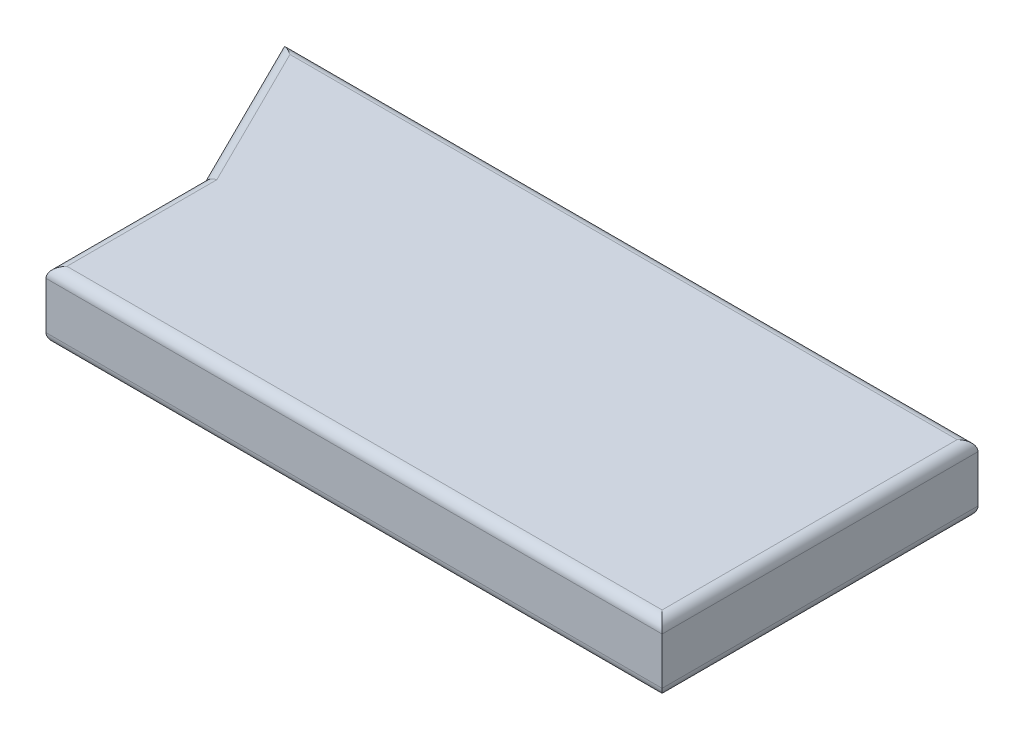
ISO-10303-21;
HEADER;
FILE_DESCRIPTION(('STEP AP214'),'2;1');
FILE_NAME('part.step','',(''),(''),'','','');
FILE_SCHEMA(('AUTOMOTIVE_DESIGN { 1 0 10303 214 1 1 1 1 }'));
ENDSEC;
DATA;
#1=APPLICATION_CONTEXT('core data for automotive mechanical design processes');
#2=APPLICATION_PROTOCOL_DEFINITION('international standard','automotive_design',2000,#1);
#3=PRODUCT_CONTEXT('',#1,'mechanical');
#4=PRODUCT('Part','Part','',(#3));
#5=PRODUCT_RELATED_PRODUCT_CATEGORY('part','',(#4));
#6=PRODUCT_DEFINITION_FORMATION('','',#4);
#7=PRODUCT_DEFINITION_CONTEXT('part definition',#1,'design');
#8=PRODUCT_DEFINITION('design','',#6,#7);
#9=PRODUCT_DEFINITION_SHAPE('','',#8);
#10=(LENGTH_UNIT() NAMED_UNIT(*) SI_UNIT(.MILLI.,.METRE.));
#11=(NAMED_UNIT(*) PLANE_ANGLE_UNIT() SI_UNIT($,.RADIAN.));
#12=(NAMED_UNIT(*) SI_UNIT($,.STERADIAN.) SOLID_ANGLE_UNIT());
#13=UNCERTAINTY_MEASURE_WITH_UNIT(LENGTH_MEASURE(1.E-05),#10,'distance_accuracy_value','');
#14=(GEOMETRIC_REPRESENTATION_CONTEXT(3) GLOBAL_UNCERTAINTY_ASSIGNED_CONTEXT((#13)) GLOBAL_UNIT_ASSIGNED_CONTEXT((#10,
#11,#12)) REPRESENTATION_CONTEXT('',''));
#15=CARTESIAN_POINT('',(0.,0.,0.));
#16=DIRECTION('',(0.,0.,1.));
#17=DIRECTION('',(1.,0.,0.));
#18=AXIS2_PLACEMENT_3D('',#15,#16,#17);
#19=CARTESIAN_POINT('',(0.,13.,-30.25));
#20=DIRECTION('',(0.,0.,1.));
#21=DIRECTION('',(1.,0.,0.));
#22=AXIS2_PLACEMENT_3D('',#19,#20,#21);
#23=PLANE('',#22);
#24=DIRECTION('',(0.,-1.,0.));
#25=VECTOR('',#24,1.);
#26=CARTESIAN_POINT('',(59.,13.,-30.25));
#27=LINE('',#26,#25);
#28=CARTESIAN_POINT('',(59.,11.,-30.25));
#29=VERTEX_POINT('',#28);
#30=CARTESIAN_POINT('',(59.,2.,-30.25));
#31=VERTEX_POINT('',#30);
#32=EDGE_CURVE('E172',#29,#31,#27,.T.);
#33=ORIENTED_EDGE('',*,*,#32,.T.);
#34=DIRECTION('',(-1.,0.,0.));
#35=VECTOR('',#34,1.);
#36=CARTESIAN_POINT('',(0.,2.,-30.25));
#37=LINE('',#36,#35);
#38=CARTESIAN_POINT('',(-74.,2.,-30.25));
#39=VERTEX_POINT('',#38);
#40=EDGE_CURVE('E11',#31,#39,#37,.T.);
#41=ORIENTED_EDGE('',*,*,#40,.T.);
#42=DIRECTION('',(0.,-1.,0.));
#43=VECTOR('',#42,1.);
#44=CARTESIAN_POINT('',(-74.,13.,-30.25));
#45=LINE('',#44,#43);
#46=CARTESIAN_POINT('',(-74.,11.,-30.25));
#47=VERTEX_POINT('',#46);
#48=EDGE_CURVE('E143',#47,#39,#45,.T.);
#49=ORIENTED_EDGE('',*,*,#48,.F.);
#50=DIRECTION('',(-1.,0.,0.));
#51=VECTOR('',#50,1.);
#52=CARTESIAN_POINT('',(59.,11.,-30.2500000000001));
#53=LINE('',#52,#51);
#54=EDGE_CURVE('E161',#47,#29,#53,.F.);
#55=ORIENTED_EDGE('',*,*,#54,.T.);
#56=EDGE_LOOP('',(#33,#41,#49,#55));
#57=FACE_BOUND('',#56,.T.);
#58=ADVANCED_FACE('F43',(#57),#23,.F.);
#59=CARTESIAN_POINT('',(-47.3559015404857,13.,23.4822652266871));
#60=DIRECTION('',(0.895903119199438,0.,-0.444249480594763));
#61=DIRECTION('',(-0.444249480594763,0.,-0.895903119199438));
#62=AXIS2_PLACEMENT_3D('',#59,#60,#61);
#63=PLANE('',#62);
#64=ORIENTED_EDGE('',*,*,#48,.T.);
#65=DIRECTION('',(0.444249480594763,0.,0.895903119199438));
#66=VECTOR('',#65,1.);
#67=CARTESIAN_POINT('',(-47.3559015404857,2.,23.4822652266871));
#68=LINE('',#67,#66);
#69=CARTESIAN_POINT('',(-59.,2.,0.));
#70=VERTEX_POINT('',#69);
#71=EDGE_CURVE('E162',#39,#70,#68,.T.);
#72=ORIENTED_EDGE('',*,*,#71,.T.);
#73=DIRECTION('',(0.,-1.,0.));
#74=VECTOR('',#73,1.);
#75=CARTESIAN_POINT('',(-59.,13.,0.));
#76=LINE('',#75,#74);
#77=CARTESIAN_POINT('',(-59.,11.,0.));
#78=VERTEX_POINT('',#77);
#79=EDGE_CURVE('E221',#78,#70,#76,.T.);
#80=ORIENTED_EDGE('',*,*,#79,.F.);
#81=DIRECTION('',(0.444249480594763,0.,0.895903119199438));
#82=VECTOR('',#81,1.);
#83=CARTESIAN_POINT('',(-74.,11.,-30.25));
#84=LINE('',#83,#82);
#85=EDGE_CURVE('E159',#78,#47,#84,.F.);
#86=ORIENTED_EDGE('',*,*,#85,.T.);
#87=EDGE_LOOP('',(#64,#72,#80,#86));
#88=FACE_BOUND('',#87,.T.);
#89=ADVANCED_FACE('F217',(#88),#63,.F.);
#90=CARTESIAN_POINT('',(-59.,13.,0.));
#91=DIRECTION('',(-1.,0.,0.));
#92=DIRECTION('',(0.,0.,1.));
#93=AXIS2_PLACEMENT_3D('',#90,#91,#92);
#94=PLANE('',#93);
#95=ORIENTED_EDGE('',*,*,#79,.T.);
#96=DIRECTION('',(0.,0.,-1.));
#97=VECTOR('',#96,1.);
#98=CARTESIAN_POINT('',(-59.,2.,30.25));
#99=LINE('',#98,#97);
#100=CARTESIAN_POINT('',(-59.,2.,30.25));
#101=VERTEX_POINT('',#100);
#102=EDGE_CURVE('E186',#70,#101,#99,.F.);
#103=ORIENTED_EDGE('',*,*,#102,.T.);
#104=DIRECTION('',(0.,-1.,0.));
#105=VECTOR('',#104,1.);
#106=CARTESIAN_POINT('',(-59.,13.,30.25));
#107=LINE('',#106,#105);
#108=CARTESIAN_POINT('',(-59.,11.,30.25));
#109=VERTEX_POINT('',#108);
#110=EDGE_CURVE('E223',#109,#101,#107,.T.);
#111=ORIENTED_EDGE('',*,*,#110,.F.);
#112=DIRECTION('',(0.,0.,-1.));
#113=VECTOR('',#112,1.);
#114=CARTESIAN_POINT('',(-59.,11.,0.));
#115=LINE('',#114,#113);
#116=EDGE_CURVE('E157',#109,#78,#115,.T.);
#117=ORIENTED_EDGE('',*,*,#116,.T.);
#118=EDGE_LOOP('',(#95,#103,#111,#117));
#119=FACE_BOUND('',#118,.T.);
#120=ADVANCED_FACE('F243',(#119),#94,.T.);
#121=CARTESIAN_POINT('',(0.,13.,30.25));
#122=DIRECTION('',(0.,0.,-1.));
#123=DIRECTION('',(-1.,0.,0.));
#124=AXIS2_PLACEMENT_3D('',#121,#122,#123);
#125=PLANE('',#124);
#126=ORIENTED_EDGE('',*,*,#110,.T.);
#127=DIRECTION('',(1.,0.,0.));
#128=VECTOR('',#127,1.);
#129=CARTESIAN_POINT('',(0.,2.,30.25));
#130=LINE('',#129,#128);
#131=CARTESIAN_POINT('',(59.,2.,30.25));
#132=VERTEX_POINT('',#131);
#133=EDGE_CURVE('E67',#101,#132,#130,.T.);
#134=ORIENTED_EDGE('',*,*,#133,.T.);
#135=DIRECTION('',(0.,-1.,0.));
#136=VECTOR('',#135,1.);
#137=CARTESIAN_POINT('',(59.,13.,30.25));
#138=LINE('',#137,#136);
#139=CARTESIAN_POINT('',(59.,11.,30.25));
#140=VERTEX_POINT('',#139);
#141=EDGE_CURVE('E238',#140,#132,#138,.T.);
#142=ORIENTED_EDGE('',*,*,#141,.F.);
#143=DIRECTION('',(1.,0.,0.));
#144=VECTOR('',#143,1.);
#145=CARTESIAN_POINT('',(-59.,11.,30.25));
#146=LINE('',#145,#144);
#147=EDGE_CURVE('E150',#140,#109,#146,.F.);
#148=ORIENTED_EDGE('',*,*,#147,.T.);
#149=EDGE_LOOP('',(#126,#134,#142,#148));
#150=FACE_BOUND('',#149,.T.);
#151=ADVANCED_FACE('F239',(#150),#125,.F.);
#152=CARTESIAN_POINT('',(59.,13.,0.));
#153=DIRECTION('',(-1.,0.,0.));
#154=DIRECTION('',(0.,0.,1.));
#155=AXIS2_PLACEMENT_3D('',#152,#153,#154);
#156=PLANE('',#155);
#157=ORIENTED_EDGE('',*,*,#141,.T.);
#158=DIRECTION('',(0.,0.,-1.));
#159=VECTOR('',#158,1.);
#160=CARTESIAN_POINT('',(59.,2.,0.));
#161=LINE('',#160,#159);
#162=EDGE_CURVE('E52',#132,#31,#161,.T.);
#163=ORIENTED_EDGE('',*,*,#162,.T.);
#164=ORIENTED_EDGE('',*,*,#32,.F.);
#165=DIRECTION('',(0.,0.,-1.));
#166=VECTOR('',#165,1.);
#167=CARTESIAN_POINT('',(59.,11.,30.25));
#168=LINE('',#167,#166);
#169=EDGE_CURVE('E130',#29,#140,#168,.F.);
#170=ORIENTED_EDGE('',*,*,#169,.T.);
#171=EDGE_LOOP('',(#157,#163,#164,#170));
#172=FACE_BOUND('',#171,.T.);
#173=ADVANCED_FACE('F237',(#172),#156,.F.);
#174=CARTESIAN_POINT('',(0.,13.,0.));
#175=DIRECTION('',(0.,1.,0.));
#176=DIRECTION('',(0.,0.,1.));
#177=AXIS2_PLACEMENT_3D('',#174,#175,#176);
#178=PLANE('',#177);
#179=DIRECTION('',(1.,0.,0.));
#180=VECTOR('',#179,1.);
#181=CARTESIAN_POINT('',(59.,13.,28.25));
#182=LINE('',#181,#180);
#183=CARTESIAN_POINT('',(-57.,13.,28.25));
#184=VERTEX_POINT('',#183);
#185=CARTESIAN_POINT('',(57.,13.,28.25));
#186=VERTEX_POINT('',#185);
#187=EDGE_CURVE('E147',#184,#186,#182,.T.);
#188=ORIENTED_EDGE('',*,*,#187,.T.);
#189=DIRECTION('',(0.,0.,-1.));
#190=VECTOR('',#189,1.);
#191=CARTESIAN_POINT('',(57.,13.,-30.25));
#192=LINE('',#191,#190);
#193=CARTESIAN_POINT('',(57.,13.,-28.2500000000001));
#194=VERTEX_POINT('',#193);
#195=EDGE_CURVE('E128',#186,#194,#192,.T.);
#196=ORIENTED_EDGE('',*,*,#195,.T.);
#197=DIRECTION('',(-1.,0.,0.));
#198=VECTOR('',#197,1.);
#199=CARTESIAN_POINT('',(-74.,13.,-28.25));
#200=LINE('',#199,#198);
#201=CARTESIAN_POINT('',(-70.775880227127,13.,-28.25));
#202=VERTEX_POINT('',#201);
#203=EDGE_CURVE('E136',#194,#202,#200,.T.);
#204=ORIENTED_EDGE('',*,*,#203,.T.);
#205=DIRECTION('',(0.444249480594763,0.,0.895903119199438));
#206=VECTOR('',#205,1.);
#207=CARTESIAN_POINT('',(-57.2081937616011,13.,-0.888498961189546));
#208=LINE('',#207,#206);
#209=CARTESIAN_POINT('',(-57.,13.,-0.468641541960611));
#210=VERTEX_POINT('',#209);
#211=EDGE_CURVE('E142',#202,#210,#208,.T.);
#212=ORIENTED_EDGE('',*,*,#211,.T.);
#213=DIRECTION('',(0.,0.,-1.));
#214=VECTOR('',#213,1.);
#215=CARTESIAN_POINT('',(-57.,13.,0.));
#216=LINE('',#215,#214);
#217=EDGE_CURVE('E152',#210,#184,#216,.F.);
#218=ORIENTED_EDGE('',*,*,#217,.T.);
#219=EDGE_LOOP('',(#188,#196,#204,#212,#218));
#220=FACE_BOUND('',#219,.T.);
#221=ADVANCED_FACE('F145',(#220),#178,.T.);
#222=CARTESIAN_POINT('',(0.,0.,0.));
#223=DIRECTION('',(0.,1.,0.));
#224=DIRECTION('',(0.,0.,1.));
#225=AXIS2_PLACEMENT_3D('',#222,#223,#224);
#226=PLANE('',#225);
#227=DIRECTION('',(0.,0.,-1.));
#228=VECTOR('',#227,1.);
#229=CARTESIAN_POINT('',(-57.,0.,0.));
#230=LINE('',#229,#228);
#231=CARTESIAN_POINT('',(-57.,0.,28.25));
#232=VERTEX_POINT('',#231);
#233=CARTESIAN_POINT('',(-57.,0.,-0.468641541960597));
#234=VERTEX_POINT('',#233);
#235=EDGE_CURVE('E181',#232,#234,#230,.T.);
#236=ORIENTED_EDGE('',*,*,#235,.T.);
#237=DIRECTION('',(0.444249480594763,0.,0.895903119199438));
#238=VECTOR('',#237,1.);
#239=CARTESIAN_POINT('',(-45.5640953020868,0.,22.5937662654976));
#240=LINE('',#239,#238);
#241=CARTESIAN_POINT('',(-70.775880227127,0.,-28.25));
#242=VERTEX_POINT('',#241);
#243=EDGE_CURVE('E183',#234,#242,#240,.F.);
#244=ORIENTED_EDGE('',*,*,#243,.T.);
#245=DIRECTION('',(-1.,0.,0.));
#246=VECTOR('',#245,1.);
#247=CARTESIAN_POINT('',(0.,0.,-28.25));
#248=LINE('',#247,#246);
#249=CARTESIAN_POINT('',(57.,0.,-28.2500000000001));
#250=VERTEX_POINT('',#249);
#251=EDGE_CURVE('E175',#242,#250,#248,.F.);
#252=ORIENTED_EDGE('',*,*,#251,.T.);
#253=DIRECTION('',(0.,0.,-1.));
#254=VECTOR('',#253,1.);
#255=CARTESIAN_POINT('',(57.,0.,0.));
#256=LINE('',#255,#254);
#257=CARTESIAN_POINT('',(57.,0.,28.25));
#258=VERTEX_POINT('',#257);
#259=EDGE_CURVE('E177',#250,#258,#256,.F.);
#260=ORIENTED_EDGE('',*,*,#259,.T.);
#261=DIRECTION('',(1.,0.,0.));
#262=VECTOR('',#261,1.);
#263=CARTESIAN_POINT('',(0.,0.,28.25));
#264=LINE('',#263,#262);
#265=EDGE_CURVE('E179',#258,#232,#264,.F.);
#266=ORIENTED_EDGE('',*,*,#265,.T.);
#267=EDGE_LOOP('',(#236,#244,#252,#260,#266));
#268=FACE_BOUND('',#267,.T.);
#269=ADVANCED_FACE('F251',(#268),#226,.F.);
#270=CARTESIAN_POINT('',(-57.,11.,0.));
#271=DIRECTION('',(0.,0.,-1.));
#272=DIRECTION('',(-1.,0.,0.));
#273=AXIS2_PLACEMENT_3D('',#270,#271,#272);
#274=CYLINDRICAL_SURFACE('',#273,2.);
#275=CARTESIAN_POINT('',(-57.,11.,28.25));
#276=DIRECTION('',(-0.707106781186547,0.,-0.707106781186547));
#277=DIRECTION('',(0.707106781186547,0.,-0.707106781186547));
#278=AXIS2_PLACEMENT_3D('',#275,#276,#277);
#279=ELLIPSE('',#278,2.82842712474619,2.);
#280=EDGE_CURVE('E166',#184,#109,#279,.F.);
#281=ORIENTED_EDGE('',*,*,#280,.F.);
#282=ORIENTED_EDGE('',*,*,#217,.F.);
#283=CARTESIAN_POINT('',(-57.,11.,-0.46864154196062));
#284=DIRECTION('',(-0.228141272899668,0.,-0.973628039653604));
#285=DIRECTION('',(0.973628039653604,0.,-0.228141272899668));
#286=AXIS2_PLACEMENT_3D('',#283,#284,#285);
#287=ELLIPSE('',#286,2.05417255722376,2.);
#288=EDGE_CURVE('E169',#78,#210,#287,.T.);
#289=ORIENTED_EDGE('',*,*,#288,.F.);
#290=ORIENTED_EDGE('',*,*,#116,.F.);
#291=EDGE_LOOP('',(#281,#282,#289,#290));
#292=FACE_BOUND('',#291,.T.);
#293=ADVANCED_FACE('F232',(#292),#274,.T.);
#294=CARTESIAN_POINT('',(-45.5640953020868,11.,22.5937662654976));
#295=DIRECTION('',(-0.444249480594763,0.,-0.895903119199438));
#296=DIRECTION('',(-0.895903119199438,0.,0.444249480594763));
#297=AXIS2_PLACEMENT_3D('',#294,#295,#296);
#298=CYLINDRICAL_SURFACE('',#297,2.);
#299=ORIENTED_EDGE('',*,*,#288,.T.);
#300=ORIENTED_EDGE('',*,*,#211,.F.);
#301=CARTESIAN_POINT('',(-70.775880227127,11.,-28.25));
#302=DIRECTION('',(0.527138748056542,0.,-0.849779230328314));
#303=DIRECTION('',(0.849779230328314,0.,0.527138748056542));
#304=AXIS2_PLACEMENT_3D('',#301,#302,#303);
#305=ELLIPSE('',#304,3.79406751519142,2.);
#306=EDGE_CURVE('E139',#47,#202,#305,.T.);
#307=ORIENTED_EDGE('',*,*,#306,.F.);
#308=ORIENTED_EDGE('',*,*,#85,.F.);
#309=EDGE_LOOP('',(#299,#300,#307,#308));
#310=FACE_BOUND('',#309,.T.);
#311=ADVANCED_FACE('F275',(#310),#298,.T.);
#312=CARTESIAN_POINT('',(0.,11.,28.25));
#313=DIRECTION('',(-1.,0.,0.));
#314=DIRECTION('',(0.,0.,1.));
#315=AXIS2_PLACEMENT_3D('',#312,#313,#314);
#316=CYLINDRICAL_SURFACE('',#315,2.);
#317=ORIENTED_EDGE('',*,*,#280,.T.);
#318=ORIENTED_EDGE('',*,*,#147,.F.);
#319=CARTESIAN_POINT('',(57.,11.,28.25));
#320=DIRECTION('',(-0.707106781186547,0.,0.707106781186547));
#321=DIRECTION('',(-0.707106781186547,0.,-0.707106781186547));
#322=AXIS2_PLACEMENT_3D('',#319,#320,#321);
#323=ELLIPSE('',#322,2.82842712474619,2.);
#324=EDGE_CURVE('E133',#186,#140,#323,.F.);
#325=ORIENTED_EDGE('',*,*,#324,.F.);
#326=ORIENTED_EDGE('',*,*,#187,.F.);
#327=EDGE_LOOP('',(#317,#318,#325,#326));
#328=FACE_BOUND('',#327,.T.);
#329=ADVANCED_FACE('F235',(#328),#316,.T.);
#330=CARTESIAN_POINT('',(0.,11.,-28.25));
#331=DIRECTION('',(1.,0.,0.));
#332=DIRECTION('',(0.,0.,-1.));
#333=AXIS2_PLACEMENT_3D('',#330,#331,#332);
#334=CYLINDRICAL_SURFACE('',#333,2.);
#335=ORIENTED_EDGE('',*,*,#306,.T.);
#336=ORIENTED_EDGE('',*,*,#203,.F.);
#337=CARTESIAN_POINT('',(57.,11.,-28.2500000000001));
#338=DIRECTION('',(0.707106781186548,0.,0.707106781186547));
#339=DIRECTION('',(0.707106781186547,0.,-0.707106781186548));
#340=AXIS2_PLACEMENT_3D('',#337,#338,#339);
#341=ELLIPSE('',#340,2.82842712474619,2.);
#342=EDGE_CURVE('E124',#29,#194,#341,.T.);
#343=ORIENTED_EDGE('',*,*,#342,.F.);
#344=ORIENTED_EDGE('',*,*,#54,.F.);
#345=EDGE_LOOP('',(#335,#336,#343,#344));
#346=FACE_BOUND('',#345,.T.);
#347=ADVANCED_FACE('F137',(#346),#334,.T.);
#348=CARTESIAN_POINT('',(57.,11.,0.));
#349=DIRECTION('',(0.,0.,1.));
#350=DIRECTION('',(1.,0.,0.));
#351=AXIS2_PLACEMENT_3D('',#348,#349,#350);
#352=CYLINDRICAL_SURFACE('',#351,2.);
#353=ORIENTED_EDGE('',*,*,#324,.T.);
#354=ORIENTED_EDGE('',*,*,#169,.F.);
#355=ORIENTED_EDGE('',*,*,#342,.T.);
#356=ORIENTED_EDGE('',*,*,#195,.F.);
#357=EDGE_LOOP('',(#353,#354,#355,#356));
#358=FACE_BOUND('',#357,.T.);
#359=ADVANCED_FACE('F126',(#358),#352,.T.);
#360=CARTESIAN_POINT('',(57.,2.,0.));
#361=DIRECTION('',(0.,0.,-1.));
#362=DIRECTION('',(-1.,0.,0.));
#363=AXIS2_PLACEMENT_3D('',#360,#361,#362);
#364=CYLINDRICAL_SURFACE('',#363,2.);
#365=CARTESIAN_POINT('',(57.,2.,-28.2500000000001));
#366=DIRECTION('',(-0.707106781186548,0.,-0.707106781186547));
#367=DIRECTION('',(-0.707106781186547,0.,0.707106781186548));
#368=AXIS2_PLACEMENT_3D('',#365,#366,#367);
#369=ELLIPSE('',#368,2.82842712474619,2.);
#370=EDGE_CURVE('E196',#31,#250,#369,.T.);
#371=ORIENTED_EDGE('',*,*,#370,.F.);
#372=ORIENTED_EDGE('',*,*,#162,.F.);
#373=CARTESIAN_POINT('',(57.,2.,28.25));
#374=DIRECTION('',(0.707106781186547,0.,-0.707106781186547));
#375=DIRECTION('',(-0.707106781186547,0.,-0.707106781186547));
#376=AXIS2_PLACEMENT_3D('',#373,#374,#375);
#377=ELLIPSE('',#376,2.82842712474619,2.);
#378=EDGE_CURVE('E47',#258,#132,#377,.F.);
#379=ORIENTED_EDGE('',*,*,#378,.F.);
#380=ORIENTED_EDGE('',*,*,#259,.F.);
#381=EDGE_LOOP('',(#371,#372,#379,#380));
#382=FACE_BOUND('',#381,.T.);
#383=ADVANCED_FACE('F45',(#382),#364,.T.);
#384=CARTESIAN_POINT('',(0.,2.,28.25));
#385=DIRECTION('',(1.,0.,0.));
#386=DIRECTION('',(0.,0.,-1.));
#387=AXIS2_PLACEMENT_3D('',#384,#385,#386);
#388=CYLINDRICAL_SURFACE('',#387,2.);
#389=ORIENTED_EDGE('',*,*,#378,.T.);
#390=ORIENTED_EDGE('',*,*,#133,.F.);
#391=CARTESIAN_POINT('',(-57.,2.,28.25));
#392=DIRECTION('',(0.707106781186547,0.,0.707106781186547));
#393=DIRECTION('',(0.707106781186547,0.,-0.707106781186547));
#394=AXIS2_PLACEMENT_3D('',#391,#392,#393);
#395=ELLIPSE('',#394,2.82842712474619,2.);
#396=EDGE_CURVE('E194',#232,#101,#395,.F.);
#397=ORIENTED_EDGE('',*,*,#396,.F.);
#398=ORIENTED_EDGE('',*,*,#265,.F.);
#399=EDGE_LOOP('',(#389,#390,#397,#398));
#400=FACE_BOUND('',#399,.T.);
#401=ADVANCED_FACE('F206',(#400),#388,.T.);
#402=CARTESIAN_POINT('',(0.,2.,-28.25));
#403=DIRECTION('',(-1.,0.,0.));
#404=DIRECTION('',(0.,0.,1.));
#405=AXIS2_PLACEMENT_3D('',#402,#403,#404);
#406=CYLINDRICAL_SURFACE('',#405,2.);
#407=ORIENTED_EDGE('',*,*,#370,.T.);
#408=ORIENTED_EDGE('',*,*,#251,.F.);
#409=CARTESIAN_POINT('',(-70.775880227127,2.,-28.25));
#410=DIRECTION('',(-0.527138748056542,0.,0.849779230328314));
#411=DIRECTION('',(-0.849779230328314,0.,-0.527138748056542));
#412=AXIS2_PLACEMENT_3D('',#409,#410,#411);
#413=ELLIPSE('',#412,3.79406751519142,2.);
#414=EDGE_CURVE('E192',#39,#242,#413,.T.);
#415=ORIENTED_EDGE('',*,*,#414,.F.);
#416=ORIENTED_EDGE('',*,*,#40,.F.);
#417=EDGE_LOOP('',(#407,#408,#415,#416));
#418=FACE_BOUND('',#417,.T.);
#419=ADVANCED_FACE('F211',(#418),#406,.T.);
#420=CARTESIAN_POINT('',(-57.,2.,0.));
#421=DIRECTION('',(0.,0.,1.));
#422=DIRECTION('',(1.,0.,0.));
#423=AXIS2_PLACEMENT_3D('',#420,#421,#422);
#424=CYLINDRICAL_SURFACE('',#423,2.);
#425=ORIENTED_EDGE('',*,*,#396,.T.);
#426=ORIENTED_EDGE('',*,*,#102,.F.);
#427=CARTESIAN_POINT('',(-57.,2.,-0.468641541960624));
#428=DIRECTION('',(0.228141272899668,0.,0.973628039653604));
#429=DIRECTION('',(0.973628039653604,0.,-0.228141272899668));
#430=AXIS2_PLACEMENT_3D('',#427,#428,#429);
#431=ELLIPSE('',#430,2.05417255722376,2.);
#432=EDGE_CURVE('E190',#234,#70,#431,.F.);
#433=ORIENTED_EDGE('',*,*,#432,.F.);
#434=ORIENTED_EDGE('',*,*,#235,.F.);
#435=EDGE_LOOP('',(#425,#426,#433,#434));
#436=FACE_BOUND('',#435,.T.);
#437=ADVANCED_FACE('F247',(#436),#424,.T.);
#438=CARTESIAN_POINT('',(-45.5640953020868,2.,22.5937662654976));
#439=DIRECTION('',(0.444249480594763,0.,0.895903119199438));
#440=DIRECTION('',(0.895903119199438,0.,-0.444249480594763));
#441=AXIS2_PLACEMENT_3D('',#438,#439,#440);
#442=CYLINDRICAL_SURFACE('',#441,2.);
#443=ORIENTED_EDGE('',*,*,#414,.T.);
#444=ORIENTED_EDGE('',*,*,#243,.F.);
#445=ORIENTED_EDGE('',*,*,#432,.T.);
#446=ORIENTED_EDGE('',*,*,#71,.F.);
#447=EDGE_LOOP('',(#443,#444,#445,#446));
#448=FACE_BOUND('',#447,.T.);
#449=ADVANCED_FACE('F253',(#448),#442,.T.);
#450=CLOSED_SHELL('',(#58,#89,#120,#151,#173,#221,#269,#293,#311,#329,#347,#359,#383,#401,#419,
#437,#449));
#451=MANIFOLD_SOLID_BREP('B2',#450);
#452=ADVANCED_BREP_SHAPE_REPRESENTATION('',(#18,#451),#14);
#453=SHAPE_DEFINITION_REPRESENTATION(#9,#452);
ENDSEC;
END-ISO-10303-21;
